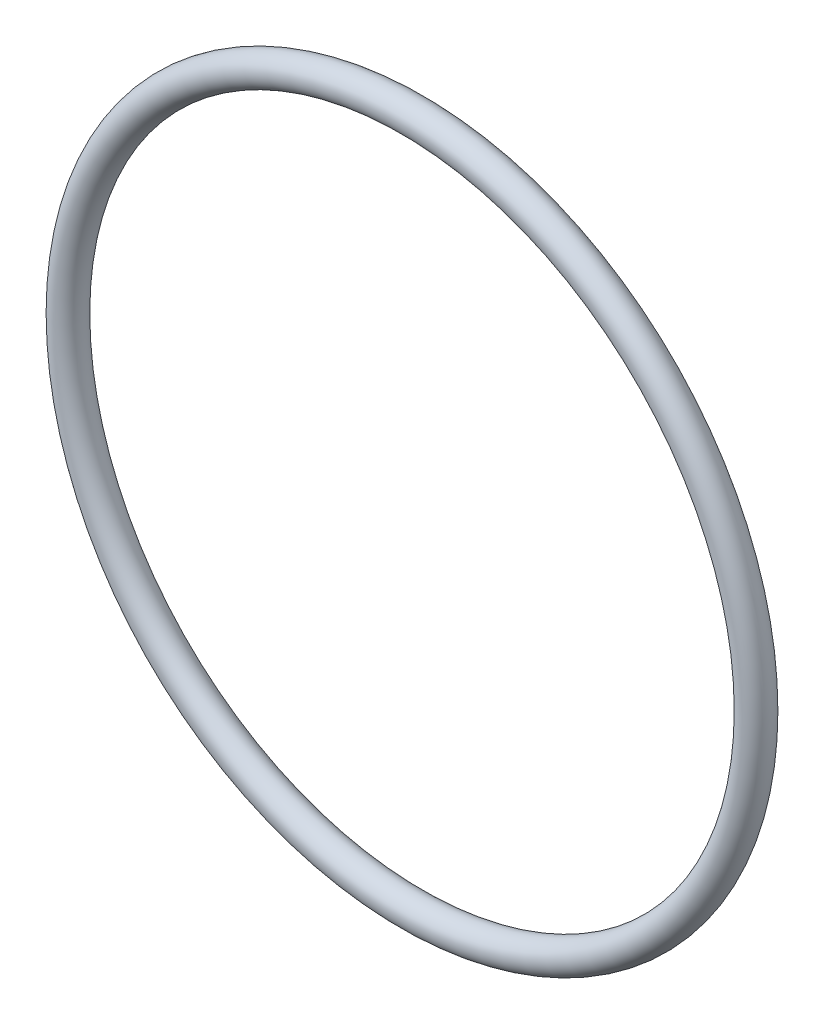
ISO-10303-21;
HEADER;
FILE_DESCRIPTION(('STEP AP214'),'2;1');
FILE_NAME('part.step','',(''),(''),'','','');
FILE_SCHEMA(('AUTOMOTIVE_DESIGN { 1 0 10303 214 1 1 1 1 }'));
ENDSEC;
DATA;
#1=APPLICATION_CONTEXT('core data for automotive mechanical design processes');
#2=APPLICATION_PROTOCOL_DEFINITION('international standard','automotive_design',2000,#1);
#3=PRODUCT_CONTEXT('',#1,'mechanical');
#4=PRODUCT('Part','Part','',(#3));
#5=PRODUCT_RELATED_PRODUCT_CATEGORY('part','',(#4));
#6=PRODUCT_DEFINITION_FORMATION('','',#4);
#7=PRODUCT_DEFINITION_CONTEXT('part definition',#1,'design');
#8=PRODUCT_DEFINITION('design','',#6,#7);
#9=PRODUCT_DEFINITION_SHAPE('','',#8);
#10=(LENGTH_UNIT() NAMED_UNIT(*) SI_UNIT(.MILLI.,.METRE.));
#11=(NAMED_UNIT(*) PLANE_ANGLE_UNIT() SI_UNIT($,.RADIAN.));
#12=(NAMED_UNIT(*) SI_UNIT($,.STERADIAN.) SOLID_ANGLE_UNIT());
#13=UNCERTAINTY_MEASURE_WITH_UNIT(LENGTH_MEASURE(1.E-05),#10,'distance_accuracy_value','');
#14=(GEOMETRIC_REPRESENTATION_CONTEXT(3) GLOBAL_UNCERTAINTY_ASSIGNED_CONTEXT((#13)) GLOBAL_UNIT_ASSIGNED_CONTEXT((#10,
#11,#12)) REPRESENTATION_CONTEXT('',''));
#15=CARTESIAN_POINT('',(0.,0.,0.));
#16=DIRECTION('',(0.,0.,1.));
#17=DIRECTION('',(1.,0.,0.));
#18=AXIS2_PLACEMENT_3D('',#15,#16,#17);
#19=CARTESIAN_POINT('',(0.,0.,0.));
#20=DIRECTION('',(0.,0.,1.));
#21=DIRECTION('',(1.,0.,0.));
#22=AXIS2_PLACEMENT_3D('',#19,#20,#21);
#23=TOROIDAL_SURFACE('',#22,19.7993,0.888999999999996);
#24=CARTESIAN_POINT('',(20.6883,0.,0.));
#25=VERTEX_POINT('',#24);
#26=VERTEX_LOOP('',#25);
#27=FACE_BOUND('',#26,.T.);
#28=ADVANCED_FACE('F37',(#27),#23,.T.);
#29=CLOSED_SHELL('',(#28));
#30=MANIFOLD_SOLID_BREP('B2',#29);
#31=ADVANCED_BREP_SHAPE_REPRESENTATION('',(#18,#30),#14);
#32=SHAPE_DEFINITION_REPRESENTATION(#9,#31);
ENDSEC;
END-ISO-10303-21;
